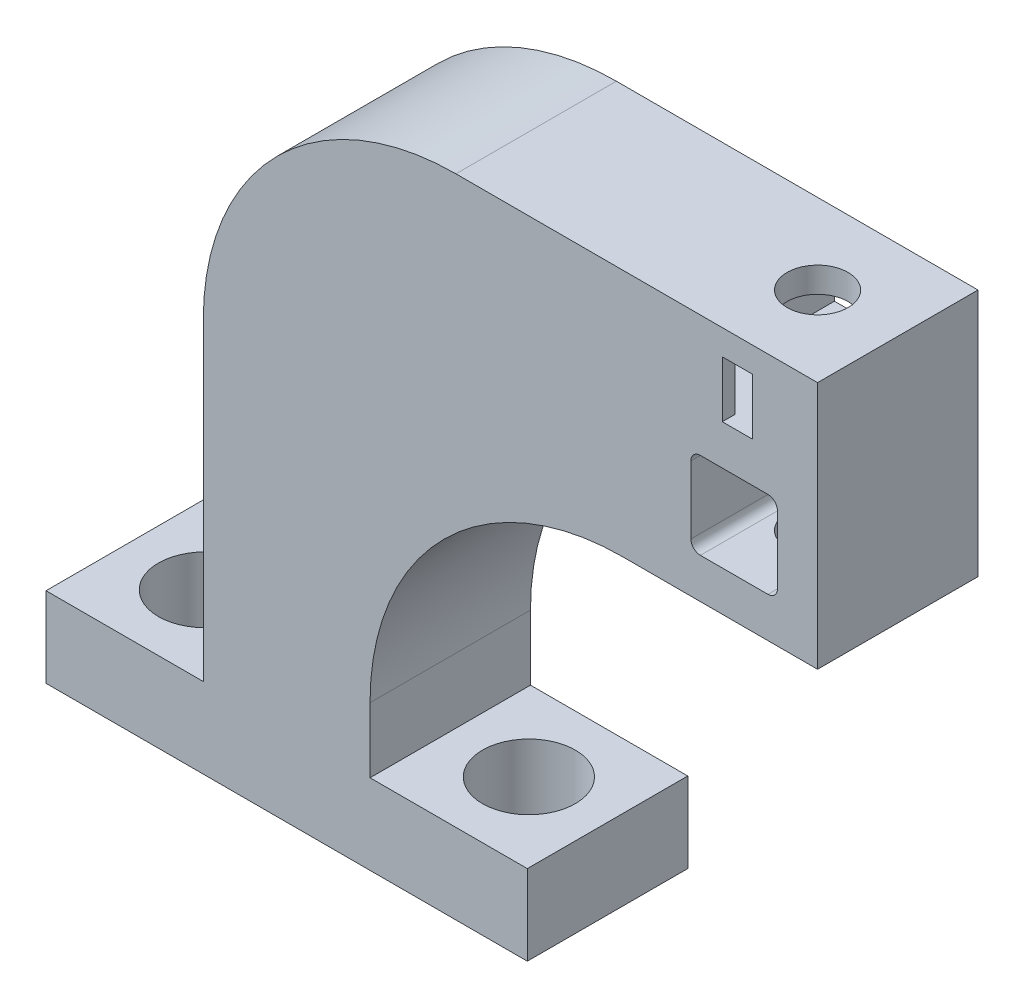
ISO-10303-21;
HEADER;
FILE_DESCRIPTION(('STEP AP214'),'2;1');
FILE_NAME('part.step','',(''),(''),'','','');
FILE_SCHEMA(('AUTOMOTIVE_DESIGN { 1 0 10303 214 1 1 1 1 }'));
ENDSEC;
DATA;
#1=APPLICATION_CONTEXT('core data for automotive mechanical design processes');
#2=APPLICATION_PROTOCOL_DEFINITION('international standard','automotive_design',2000,#1);
#3=PRODUCT_CONTEXT('',#1,'mechanical');
#4=PRODUCT('Part','Part','',(#3));
#5=PRODUCT_RELATED_PRODUCT_CATEGORY('part','',(#4));
#6=PRODUCT_DEFINITION_FORMATION('','',#4);
#7=PRODUCT_DEFINITION_CONTEXT('part definition',#1,'design');
#8=PRODUCT_DEFINITION('design','',#6,#7);
#9=PRODUCT_DEFINITION_SHAPE('','',#8);
#10=(LENGTH_UNIT() NAMED_UNIT(*) SI_UNIT(.MILLI.,.METRE.));
#11=(NAMED_UNIT(*) PLANE_ANGLE_UNIT() SI_UNIT($,.RADIAN.));
#12=(NAMED_UNIT(*) SI_UNIT($,.STERADIAN.) SOLID_ANGLE_UNIT());
#13=UNCERTAINTY_MEASURE_WITH_UNIT(LENGTH_MEASURE(1.E-05),#10,'distance_accuracy_value','');
#14=(GEOMETRIC_REPRESENTATION_CONTEXT(3) GLOBAL_UNCERTAINTY_ASSIGNED_CONTEXT((#13)) GLOBAL_UNIT_ASSIGNED_CONTEXT((#10,
#11,#12)) REPRESENTATION_CONTEXT('',''));
#15=CARTESIAN_POINT('',(0.,0.,0.));
#16=DIRECTION('',(0.,0.,1.));
#17=DIRECTION('',(1.,0.,0.));
#18=AXIS2_PLACEMENT_3D('',#15,#16,#17);
#19=CARTESIAN_POINT('',(0.,0.,57.15));
#20=DIRECTION('',(0.,0.,1.));
#21=DIRECTION('',(1.,0.,0.));
#22=AXIS2_PLACEMENT_3D('',#19,#20,#21);
#23=PLANE('',#22);
#24=DIRECTION('',(1.,0.,0.));
#25=VECTOR('',#24,1.);
#26=CARTESIAN_POINT('',(-95.06,40.417874944,57.15));
#27=LINE('',#26,#25);
#28=CARTESIAN_POINT('',(-75.06,40.417874944,57.15));
#29=VERTEX_POINT('',#28);
#30=CARTESIAN_POINT('',(-46.435,40.417874944,57.15));
#31=VERTEX_POINT('',#30);
#32=EDGE_CURVE('E413',#29,#31,#27,.T.);
#33=ORIENTED_EDGE('',*,*,#32,.F.);
#34=CARTESIAN_POINT('',(-75.06,20.417874944,57.15));
#35=DIRECTION('',(0.,0.,1.));
#36=DIRECTION('',(1.,0.,0.));
#37=AXIS2_PLACEMENT_3D('',#34,#35,#36);
#38=CIRCLE('',#37,20.);
#39=CARTESIAN_POINT('',(-95.06,20.417874944,57.15));
#40=VERTEX_POINT('',#39);
#41=EDGE_CURVE('E443',#29,#40,#38,.T.);
#42=ORIENTED_EDGE('',*,*,#41,.T.);
#43=DIRECTION('',(0.,-1.,0.));
#44=VECTOR('',#43,1.);
#45=CARTESIAN_POINT('',(-95.06,33.964999944,57.15));
#46=LINE('',#45,#44);
#47=CARTESIAN_POINT('',(-95.06,-4.38500005600002,57.15));
#48=VERTEX_POINT('',#47);
#49=EDGE_CURVE('E423',#40,#48,#46,.T.);
#50=ORIENTED_EDGE('',*,*,#49,.T.);
#51=DIRECTION('',(-1.,0.,0.));
#52=VECTOR('',#51,1.);
#53=CARTESIAN_POINT('',(-107.51,-4.38500005600001,57.15));
#54=LINE('',#53,#52);
#55=CARTESIAN_POINT('',(-107.51,-4.38500005600001,57.15));
#56=VERTEX_POINT('',#55);
#57=EDGE_CURVE('E380',#48,#56,#54,.T.);
#58=ORIENTED_EDGE('',*,*,#57,.T.);
#59=DIRECTION('',(0.,-1.,0.));
#60=VECTOR('',#59,1.);
#61=CARTESIAN_POINT('',(-107.51,-4.38500005600001,57.15));
#62=LINE('',#61,#60);
#63=CARTESIAN_POINT('',(-107.51,-10.735000056,57.15));
#64=VERTEX_POINT('',#63);
#65=EDGE_CURVE('E404',#56,#64,#62,.T.);
#66=ORIENTED_EDGE('',*,*,#65,.T.);
#67=DIRECTION('',(1.,0.,0.));
#68=VECTOR('',#67,1.);
#69=CARTESIAN_POINT('',(-95.06,-10.735000056,57.15));
#70=LINE('',#69,#68);
#71=CARTESIAN_POINT('',(-69.41,-10.735000056,57.15));
#72=VERTEX_POINT('',#71);
#73=EDGE_CURVE('E411',#64,#72,#70,.T.);
#74=ORIENTED_EDGE('',*,*,#73,.T.);
#75=DIRECTION('',(0.,-1.,0.));
#76=VECTOR('',#75,1.);
#77=CARTESIAN_POINT('',(-69.41,-4.38500005600001,57.15));
#78=LINE('',#77,#76);
#79=CARTESIAN_POINT('',(-69.41,-4.38500005600001,57.15));
#80=VERTEX_POINT('',#79);
#81=EDGE_CURVE('E392',#80,#72,#78,.T.);
#82=ORIENTED_EDGE('',*,*,#81,.F.);
#83=CARTESIAN_POINT('',(-81.86,-4.38500005600002,57.15));
#84=VERTEX_POINT('',#83);
#85=EDGE_CURVE('E382',#80,#84,#54,.T.);
#86=ORIENTED_EDGE('',*,*,#85,.T.);
#87=DIRECTION('',(0.,1.,0.));
#88=VECTOR('',#87,1.);
#89=CARTESIAN_POINT('',(-81.86,33.964999944,57.15));
#90=LINE('',#89,#88);
#91=CARTESIAN_POINT('',(-81.86,0.764999943999992,57.15));
#92=VERTEX_POINT('',#91);
#93=EDGE_CURVE('E420',#84,#92,#90,.T.);
#94=ORIENTED_EDGE('',*,*,#93,.T.);
#95=CARTESIAN_POINT('',(-61.86,0.764999943999992,57.15));
#96=DIRECTION('',(0.,0.,1.));
#97=DIRECTION('',(1.,0.,0.));
#98=AXIS2_PLACEMENT_3D('',#95,#96,#97);
#99=CIRCLE('',#98,20.);
#100=CARTESIAN_POINT('',(-61.86,20.764999944,57.15));
#101=VERTEX_POINT('',#100);
#102=EDGE_CURVE('E47',#92,#101,#99,.F.);
#103=ORIENTED_EDGE('',*,*,#102,.T.);
#104=DIRECTION('',(1.,0.,0.));
#105=VECTOR('',#104,1.);
#106=CARTESIAN_POINT('',(-46.435,20.764999944,57.15));
#107=LINE('',#106,#105);
#108=CARTESIAN_POINT('',(-46.435,20.764999944,57.15));
#109=VERTEX_POINT('',#108);
#110=EDGE_CURVE('E343',#101,#109,#107,.T.);
#111=ORIENTED_EDGE('',*,*,#110,.T.);
#112=DIRECTION('',(0.,1.,0.));
#113=VECTOR('',#112,1.);
#114=CARTESIAN_POINT('',(-46.435,40.417874944,57.15));
#115=LINE('',#114,#113);
#116=EDGE_CURVE('E358',#109,#31,#115,.T.);
#117=ORIENTED_EDGE('',*,*,#116,.T.);
#118=EDGE_LOOP('',(#33,#42,#50,#58,#66,#74,#82,#86,#94,#103,#111,#117));
#119=FACE_BOUND('',#118,.T.);
#120=DIRECTION('',(0.,1.,0.));
#121=VECTOR('',#120,1.);
#122=CARTESIAN_POINT('',(-49.61,24.689999944,57.15));
#123=LINE('',#122,#121);
#124=CARTESIAN_POINT('',(-49.61,24.689999944,57.15));
#125=VERTEX_POINT('',#124);
#126=CARTESIAN_POINT('',(-49.61,30.039999944,57.15));
#127=VERTEX_POINT('',#126);
#128=EDGE_CURVE('E253',#125,#127,#123,.T.);
#129=ORIENTED_EDGE('',*,*,#128,.F.);
#130=CARTESIAN_POINT('',(-50.36,24.689999944,57.15));
#131=DIRECTION('',(0.,0.,1.));
#132=DIRECTION('',(1.,0.,0.));
#133=AXIS2_PLACEMENT_3D('',#130,#131,#132);
#134=CIRCLE('',#133,0.750000000000001);
#135=CARTESIAN_POINT('',(-50.36,23.939999944,57.15));
#136=VERTEX_POINT('',#135);
#137=EDGE_CURVE('E249',#136,#125,#134,.T.);
#138=ORIENTED_EDGE('',*,*,#137,.F.);
#139=DIRECTION('',(1.,0.,0.));
#140=VECTOR('',#139,1.);
#141=CARTESIAN_POINT('',(-55.71,23.939999944,57.15));
#142=LINE('',#141,#140);
#143=CARTESIAN_POINT('',(-55.71,23.939999944,57.15));
#144=VERTEX_POINT('',#143);
#145=EDGE_CURVE('E337',#144,#136,#142,.T.);
#146=ORIENTED_EDGE('',*,*,#145,.F.);
#147=CARTESIAN_POINT('',(-55.71,24.689999944,57.15));
#148=DIRECTION('',(0.,0.,1.));
#149=DIRECTION('',(1.,0.,0.));
#150=AXIS2_PLACEMENT_3D('',#147,#148,#149);
#151=CIRCLE('',#150,0.749999999999994);
#152=CARTESIAN_POINT('',(-56.46,24.689999944,57.15));
#153=VERTEX_POINT('',#152);
#154=EDGE_CURVE('E334',#153,#144,#151,.T.);
#155=ORIENTED_EDGE('',*,*,#154,.F.);
#156=DIRECTION('',(0.,-1.,0.));
#157=VECTOR('',#156,1.);
#158=CARTESIAN_POINT('',(-56.46,30.039999944,57.15));
#159=LINE('',#158,#157);
#160=CARTESIAN_POINT('',(-56.46,30.039999944,57.15));
#161=VERTEX_POINT('',#160);
#162=EDGE_CURVE('E331',#161,#153,#159,.T.);
#163=ORIENTED_EDGE('',*,*,#162,.F.);
#164=CARTESIAN_POINT('',(-55.71,30.039999944,57.15));
#165=DIRECTION('',(0.,0.,1.));
#166=DIRECTION('',(1.,0.,0.));
#167=AXIS2_PLACEMENT_3D('',#164,#165,#166);
#168=CIRCLE('',#167,0.750000000000001);
#169=CARTESIAN_POINT('',(-55.71,30.789999944,57.15));
#170=VERTEX_POINT('',#169);
#171=EDGE_CURVE('E328',#170,#161,#168,.T.);
#172=ORIENTED_EDGE('',*,*,#171,.F.);
#173=DIRECTION('',(-1.,0.,0.));
#174=VECTOR('',#173,1.);
#175=CARTESIAN_POINT('',(-50.36,30.789999944,57.15));
#176=LINE('',#175,#174);
#177=CARTESIAN_POINT('',(-50.36,30.789999944,57.15));
#178=VERTEX_POINT('',#177);
#179=EDGE_CURVE('E325',#178,#170,#176,.T.);
#180=ORIENTED_EDGE('',*,*,#179,.F.);
#181=CARTESIAN_POINT('',(-50.36,30.039999944,57.15));
#182=DIRECTION('',(0.,0.,1.));
#183=DIRECTION('',(1.,0.,0.));
#184=AXIS2_PLACEMENT_3D('',#181,#182,#183);
#185=CIRCLE('',#184,0.750000000000001);
#186=EDGE_CURVE('E322',#127,#178,#185,.T.);
#187=ORIENTED_EDGE('',*,*,#186,.F.);
#188=EDGE_LOOP('',(#129,#138,#146,#155,#163,#172,#180,#187));
#189=FACE_BOUND('',#188,.T.);
#190=DIRECTION('',(0.,-1.,0.));
#191=VECTOR('',#190,1.);
#192=CARTESIAN_POINT('',(-51.5934591186013,54.5978200922383,57.15));
#193=LINE('',#192,#191);
#194=CARTESIAN_POINT('',(-51.5934591186013,38.417874944,57.15));
#195=VERTEX_POINT('',#194);
#196=CARTESIAN_POINT('',(-51.5934591186013,33.964999944,57.15));
#197=VERTEX_POINT('',#196);
#198=EDGE_CURVE('E248',#195,#197,#193,.T.);
#199=ORIENTED_EDGE('',*,*,#198,.T.);
#200=DIRECTION('',(1.,0.,0.));
#201=VECTOR('',#200,1.);
#202=CARTESIAN_POINT('',(-53.9765408813987,33.964999944,57.15));
#203=LINE('',#202,#201);
#204=CARTESIAN_POINT('',(-53.9765408813987,33.964999944,57.15));
#205=VERTEX_POINT('',#204);
#206=EDGE_CURVE('E288',#205,#197,#203,.T.);
#207=ORIENTED_EDGE('',*,*,#206,.F.);
#208=DIRECTION('',(0.,-1.,0.));
#209=VECTOR('',#208,1.);
#210=CARTESIAN_POINT('',(-53.9765408813987,54.5978200922383,57.15));
#211=LINE('',#210,#209);
#212=CARTESIAN_POINT('',(-53.9765408813987,38.417874944,57.15));
#213=VERTEX_POINT('',#212);
#214=EDGE_CURVE('E286',#213,#205,#211,.T.);
#215=ORIENTED_EDGE('',*,*,#214,.F.);
#216=DIRECTION('',(1.,0.,0.));
#217=VECTOR('',#216,1.);
#218=CARTESIAN_POINT('',(-53.9765408813987,38.417874944,57.15));
#219=LINE('',#218,#217);
#220=EDGE_CURVE('E250',#213,#195,#219,.T.);
#221=ORIENTED_EDGE('',*,*,#220,.T.);
#222=EDGE_LOOP('',(#199,#207,#215,#221));
#223=FACE_BOUND('',#222,.T.);
#224=ADVANCED_FACE('F39',(#119,#189,#223),#23,.T.);
#225=CARTESIAN_POINT('',(0.,0.,44.45));
#226=DIRECTION('',(0.,0.,1.));
#227=DIRECTION('',(1.,0.,0.));
#228=AXIS2_PLACEMENT_3D('',#225,#226,#227);
#229=PLANE('',#228);
#230=DIRECTION('',(0.,-1.,0.));
#231=VECTOR('',#230,1.);
#232=CARTESIAN_POINT('',(-95.06,33.964999944,44.45));
#233=LINE('',#232,#231);
#234=CARTESIAN_POINT('',(-95.06,20.417874944,44.45));
#235=VERTEX_POINT('',#234);
#236=CARTESIAN_POINT('',(-95.06,-4.38500005600002,44.45));
#237=VERTEX_POINT('',#236);
#238=EDGE_CURVE('E424',#235,#237,#233,.T.);
#239=ORIENTED_EDGE('',*,*,#238,.F.);
#240=CARTESIAN_POINT('',(-75.06,20.417874944,44.45));
#241=DIRECTION('',(0.,0.,1.));
#242=DIRECTION('',(1.,0.,0.));
#243=AXIS2_PLACEMENT_3D('',#240,#241,#242);
#244=CIRCLE('',#243,20.);
#245=CARTESIAN_POINT('',(-75.06,40.417874944,44.45));
#246=VERTEX_POINT('',#245);
#247=EDGE_CURVE('E447',#235,#246,#244,.F.);
#248=ORIENTED_EDGE('',*,*,#247,.T.);
#249=DIRECTION('',(-1.,0.,0.));
#250=VECTOR('',#249,1.);
#251=CARTESIAN_POINT('',(-81.86,40.417874944,44.45));
#252=LINE('',#251,#250);
#253=CARTESIAN_POINT('',(-46.435,40.417874944,44.45));
#254=VERTEX_POINT('',#253);
#255=EDGE_CURVE('E416',#254,#246,#252,.T.);
#256=ORIENTED_EDGE('',*,*,#255,.F.);
#257=DIRECTION('',(0.,-1.,0.));
#258=VECTOR('',#257,1.);
#259=CARTESIAN_POINT('',(-46.435,40.417874944,44.45));
#260=LINE('',#259,#258);
#261=CARTESIAN_POINT('',(-46.435,20.764999944,44.45));
#262=VERTEX_POINT('',#261);
#263=EDGE_CURVE('E315',#254,#262,#260,.T.);
#264=ORIENTED_EDGE('',*,*,#263,.T.);
#265=DIRECTION('',(-1.,0.,0.));
#266=VECTOR('',#265,1.);
#267=CARTESIAN_POINT('',(-46.435,20.764999944,44.45));
#268=LINE('',#267,#266);
#269=CARTESIAN_POINT('',(-61.86,20.764999944,44.45));
#270=VERTEX_POINT('',#269);
#271=EDGE_CURVE('E296',#262,#270,#268,.T.);
#272=ORIENTED_EDGE('',*,*,#271,.T.);
#273=CARTESIAN_POINT('',(-61.86,0.764999943999992,44.45));
#274=DIRECTION('',(0.,0.,1.));
#275=DIRECTION('',(1.,0.,0.));
#276=AXIS2_PLACEMENT_3D('',#273,#274,#275);
#277=CIRCLE('',#276,20.);
#278=CARTESIAN_POINT('',(-81.86,0.764999943999992,44.45));
#279=VERTEX_POINT('',#278);
#280=EDGE_CURVE('E11',#270,#279,#277,.T.);
#281=ORIENTED_EDGE('',*,*,#280,.T.);
#282=DIRECTION('',(0.,1.,0.));
#283=VECTOR('',#282,1.);
#284=CARTESIAN_POINT('',(-81.86,33.964999944,44.45));
#285=LINE('',#284,#283);
#286=CARTESIAN_POINT('',(-81.86,-4.38500005600002,44.45));
#287=VERTEX_POINT('',#286);
#288=EDGE_CURVE('E419',#287,#279,#285,.T.);
#289=ORIENTED_EDGE('',*,*,#288,.F.);
#290=DIRECTION('',(1.,0.,0.));
#291=VECTOR('',#290,1.);
#292=CARTESIAN_POINT('',(-107.51,-4.38500005600002,44.45));
#293=LINE('',#292,#291);
#294=CARTESIAN_POINT('',(-69.41,-4.38500005600002,44.45));
#295=VERTEX_POINT('',#294);
#296=EDGE_CURVE('E388',#287,#295,#293,.T.);
#297=ORIENTED_EDGE('',*,*,#296,.T.);
#298=DIRECTION('',(0.,-1.,0.));
#299=VECTOR('',#298,1.);
#300=CARTESIAN_POINT('',(-69.41,-4.38500005600002,44.45));
#301=LINE('',#300,#299);
#302=CARTESIAN_POINT('',(-69.41,-10.735000056,44.45));
#303=VERTEX_POINT('',#302);
#304=EDGE_CURVE('E397',#295,#303,#301,.T.);
#305=ORIENTED_EDGE('',*,*,#304,.T.);
#306=DIRECTION('',(-1.,0.,0.));
#307=VECTOR('',#306,1.);
#308=CARTESIAN_POINT('',(-95.06,-10.735000056,44.45));
#309=LINE('',#308,#307);
#310=CARTESIAN_POINT('',(-107.51,-10.735000056,44.45));
#311=VERTEX_POINT('',#310);
#312=EDGE_CURVE('E410',#303,#311,#309,.T.);
#313=ORIENTED_EDGE('',*,*,#312,.T.);
#314=DIRECTION('',(0.,-1.,0.));
#315=VECTOR('',#314,1.);
#316=CARTESIAN_POINT('',(-107.51,-4.38500005600002,44.45));
#317=LINE('',#316,#315);
#318=CARTESIAN_POINT('',(-107.51,-4.38500005600002,44.45));
#319=VERTEX_POINT('',#318);
#320=EDGE_CURVE('E401',#319,#311,#317,.T.);
#321=ORIENTED_EDGE('',*,*,#320,.F.);
#322=EDGE_CURVE('E389',#319,#237,#293,.T.);
#323=ORIENTED_EDGE('',*,*,#322,.T.);
#324=EDGE_LOOP('',(#239,#248,#256,#264,#272,#281,#289,#297,#305,#313,#321,#323));
#325=FACE_BOUND('',#324,.T.);
#326=DIRECTION('',(-1.,0.,0.));
#327=VECTOR('',#326,1.);
#328=CARTESIAN_POINT('',(-47.7725,33.964999944,44.45));
#329=LINE('',#328,#327);
#330=CARTESIAN_POINT('',(-47.7725,33.964999944,44.45));
#331=VERTEX_POINT('',#330);
#332=CARTESIAN_POINT('',(-57.7975,33.964999944,44.45));
#333=VERTEX_POINT('',#332);
#334=EDGE_CURVE('E275',#331,#333,#329,.T.);
#335=ORIENTED_EDGE('',*,*,#334,.F.);
#336=DIRECTION('',(0.,-1.,0.));
#337=VECTOR('',#336,1.);
#338=CARTESIAN_POINT('',(-47.7725,54.5978200922383,44.45));
#339=LINE('',#338,#337);
#340=CARTESIAN_POINT('',(-47.7725,38.417874944,44.45));
#341=VERTEX_POINT('',#340);
#342=EDGE_CURVE('E273',#341,#331,#339,.T.);
#343=ORIENTED_EDGE('',*,*,#342,.F.);
#344=DIRECTION('',(-1.,0.,0.));
#345=VECTOR('',#344,1.);
#346=CARTESIAN_POINT('',(-47.7725,38.417874944,44.45));
#347=LINE('',#346,#345);
#348=CARTESIAN_POINT('',(-57.7975,38.417874944,44.45));
#349=VERTEX_POINT('',#348);
#350=EDGE_CURVE('E269',#341,#349,#347,.T.);
#351=ORIENTED_EDGE('',*,*,#350,.T.);
#352=DIRECTION('',(0.,-1.,0.));
#353=VECTOR('',#352,1.);
#354=CARTESIAN_POINT('',(-57.7975,54.5978200922383,44.45));
#355=LINE('',#354,#353);
#356=EDGE_CURVE('E276',#349,#333,#355,.T.);
#357=ORIENTED_EDGE('',*,*,#356,.T.);
#358=EDGE_LOOP('',(#335,#343,#351,#357));
#359=FACE_BOUND('',#358,.T.);
#360=DIRECTION('',(0.,-1.,0.));
#361=VECTOR('',#360,1.);
#362=CARTESIAN_POINT('',(-49.61,24.689999944,44.45));
#363=LINE('',#362,#361);
#364=CARTESIAN_POINT('',(-49.61,30.039999944,44.45));
#365=VERTEX_POINT('',#364);
#366=CARTESIAN_POINT('',(-49.61,24.689999944,44.45));
#367=VERTEX_POINT('',#366);
#368=EDGE_CURVE('E318',#365,#367,#363,.T.);
#369=ORIENTED_EDGE('',*,*,#368,.F.);
#370=CARTESIAN_POINT('',(-50.36,30.039999944,44.45));
#371=DIRECTION('',(0.,0.,1.));
#372=DIRECTION('',(1.,0.,0.));
#373=AXIS2_PLACEMENT_3D('',#370,#371,#372);
#374=CIRCLE('',#373,0.750000000000001);
#375=CARTESIAN_POINT('',(-50.36,30.789999944,44.45));
#376=VERTEX_POINT('',#375);
#377=EDGE_CURVE('E293',#376,#365,#374,.F.);
#378=ORIENTED_EDGE('',*,*,#377,.F.);
#379=DIRECTION('',(1.,0.,0.));
#380=VECTOR('',#379,1.);
#381=CARTESIAN_POINT('',(-50.36,30.789999944,44.45));
#382=LINE('',#381,#380);
#383=CARTESIAN_POINT('',(-55.71,30.789999944,44.45));
#384=VERTEX_POINT('',#383);
#385=EDGE_CURVE('E297',#384,#376,#382,.T.);
#386=ORIENTED_EDGE('',*,*,#385,.F.);
#387=CARTESIAN_POINT('',(-55.71,30.039999944,44.45));
#388=DIRECTION('',(0.,0.,1.));
#389=DIRECTION('',(1.,0.,0.));
#390=AXIS2_PLACEMENT_3D('',#387,#388,#389);
#391=CIRCLE('',#390,0.750000000000001);
#392=CARTESIAN_POINT('',(-56.46,30.039999944,44.45));
#393=VERTEX_POINT('',#392);
#394=EDGE_CURVE('E300',#393,#384,#391,.F.);
#395=ORIENTED_EDGE('',*,*,#394,.F.);
#396=DIRECTION('',(0.,1.,0.));
#397=VECTOR('',#396,1.);
#398=CARTESIAN_POINT('',(-56.46,30.039999944,44.45));
#399=LINE('',#398,#397);
#400=CARTESIAN_POINT('',(-56.46,24.689999944,44.45));
#401=VERTEX_POINT('',#400);
#402=EDGE_CURVE('E303',#401,#393,#399,.T.);
#403=ORIENTED_EDGE('',*,*,#402,.F.);
#404=CARTESIAN_POINT('',(-55.71,24.689999944,44.45));
#405=DIRECTION('',(0.,0.,1.));
#406=DIRECTION('',(1.,0.,0.));
#407=AXIS2_PLACEMENT_3D('',#404,#405,#406);
#408=CIRCLE('',#407,0.749999999999994);
#409=CARTESIAN_POINT('',(-55.71,23.939999944,44.45));
#410=VERTEX_POINT('',#409);
#411=EDGE_CURVE('E306',#410,#401,#408,.F.);
#412=ORIENTED_EDGE('',*,*,#411,.F.);
#413=DIRECTION('',(-1.,0.,0.));
#414=VECTOR('',#413,1.);
#415=CARTESIAN_POINT('',(-55.71,23.939999944,44.45));
#416=LINE('',#415,#414);
#417=CARTESIAN_POINT('',(-50.36,23.939999944,44.45));
#418=VERTEX_POINT('',#417);
#419=EDGE_CURVE('E309',#418,#410,#416,.T.);
#420=ORIENTED_EDGE('',*,*,#419,.F.);
#421=CARTESIAN_POINT('',(-50.36,24.689999944,44.45));
#422=DIRECTION('',(0.,0.,1.));
#423=DIRECTION('',(1.,0.,0.));
#424=AXIS2_PLACEMENT_3D('',#421,#422,#423);
#425=CIRCLE('',#424,0.750000000000001);
#426=EDGE_CURVE('E312',#367,#418,#425,.F.);
#427=ORIENTED_EDGE('',*,*,#426,.F.);
#428=EDGE_LOOP('',(#369,#378,#386,#395,#403,#412,#420,#427));
#429=FACE_BOUND('',#428,.T.);
#430=ADVANCED_FACE('F465',(#325,#359,#429),#229,.F.);
#431=CARTESIAN_POINT('',(-81.86,33.964999944,57.15));
#432=DIRECTION('',(-1.,0.,0.));
#433=DIRECTION('',(0.,0.,1.));
#434=AXIS2_PLACEMENT_3D('',#431,#432,#433);
#435=PLANE('',#434);
#436=ORIENTED_EDGE('',*,*,#288,.T.);
#437=DIRECTION('',(0.,0.,1.));
#438=VECTOR('',#437,1.);
#439=CARTESIAN_POINT('',(-81.86,0.764999943999992,57.15));
#440=LINE('',#439,#438);
#441=EDGE_CURVE('E449',#279,#92,#440,.T.);
#442=ORIENTED_EDGE('',*,*,#441,.T.);
#443=ORIENTED_EDGE('',*,*,#93,.F.);
#444=DIRECTION('',(0.,0.,-1.));
#445=VECTOR('',#444,1.);
#446=CARTESIAN_POINT('',(-81.86,-4.38500005600002,57.15));
#447=LINE('',#446,#445);
#448=EDGE_CURVE('E400',#84,#287,#447,.T.);
#449=ORIENTED_EDGE('',*,*,#448,.T.);
#450=EDGE_LOOP('',(#436,#442,#443,#449));
#451=FACE_BOUND('',#450,.T.);
#452=ADVANCED_FACE('F461',(#451),#435,.F.);
#453=CARTESIAN_POINT('',(-95.06,33.964999944,57.15));
#454=DIRECTION('',(1.,0.,0.));
#455=DIRECTION('',(0.,0.,-1.));
#456=AXIS2_PLACEMENT_3D('',#453,#454,#455);
#457=PLANE('',#456);
#458=ORIENTED_EDGE('',*,*,#49,.F.);
#459=DIRECTION('',(0.,0.,1.));
#460=VECTOR('',#459,1.);
#461=CARTESIAN_POINT('',(-95.06,20.417874944,44.45));
#462=LINE('',#461,#460);
#463=EDGE_CURVE('E445',#40,#235,#462,.F.);
#464=ORIENTED_EDGE('',*,*,#463,.T.);
#465=ORIENTED_EDGE('',*,*,#238,.T.);
#466=DIRECTION('',(0.,0.,1.));
#467=VECTOR('',#466,1.);
#468=CARTESIAN_POINT('',(-95.06,-4.38500005600002,57.15));
#469=LINE('',#468,#467);
#470=EDGE_CURVE('E426',#237,#48,#469,.T.);
#471=ORIENTED_EDGE('',*,*,#470,.T.);
#472=EDGE_LOOP('',(#458,#464,#465,#471));
#473=FACE_BOUND('',#472,.T.);
#474=ADVANCED_FACE('F525',(#473),#457,.F.);
#475=CARTESIAN_POINT('',(0.,40.417874944,0.));
#476=DIRECTION('',(0.,1.,0.));
#477=DIRECTION('',(0.,0.,1.));
#478=AXIS2_PLACEMENT_3D('',#475,#476,#477);
#479=PLANE('',#478);
#480=ORIENTED_EDGE('',*,*,#255,.T.);
#481=DIRECTION('',(0.,0.,1.));
#482=VECTOR('',#481,1.);
#483=CARTESIAN_POINT('',(-75.06,40.417874944,57.15));
#484=LINE('',#483,#482);
#485=EDGE_CURVE('E431',#246,#29,#484,.T.);
#486=ORIENTED_EDGE('',*,*,#485,.T.);
#487=ORIENTED_EDGE('',*,*,#32,.T.);
#488=DIRECTION('',(0.,0.,1.));
#489=VECTOR('',#488,1.);
#490=CARTESIAN_POINT('',(-46.435,40.417874944,3.9386914458984));
#491=LINE('',#490,#489);
#492=EDGE_CURVE('E362',#254,#31,#491,.T.);
#493=ORIENTED_EDGE('',*,*,#492,.F.);
#494=EDGE_LOOP('',(#480,#486,#487,#493));
#495=FACE_BOUND('',#494,.T.);
#496=CARTESIAN_POINT('',(-52.785,40.417874944,50.8));
#497=DIRECTION('',(0.,1.,0.));
#498=DIRECTION('',(0.,0.,1.));
#499=AXIS2_PLACEMENT_3D('',#496,#497,#498);
#500=CIRCLE('',#499,2.41299999999999);
#501=CARTESIAN_POINT('',(-52.785,40.417874944,53.213));
#502=VERTEX_POINT('',#501);
#503=EDGE_CURVE('E440',#502,#502,#500,.T.);
#504=ORIENTED_EDGE('',*,*,#503,.F.);
#505=EDGE_LOOP('',(#504));
#506=FACE_BOUND('',#505,.T.);
#507=ADVANCED_FACE('F495',(#495,#506),#479,.T.);
#508=CARTESIAN_POINT('',(-84.5646703375213,-10.735000056,-24.4418244148077));
#509=DIRECTION('',(0.,1.,0.));
#510=DIRECTION('',(0.,0.,1.));
#511=AXIS2_PLACEMENT_3D('',#508,#509,#510);
#512=PLANE('',#511);
#513=CARTESIAN_POINT('',(-101.285,-10.735000056,50.8));
#514=DIRECTION('',(0.,1.,0.));
#515=DIRECTION('',(0.,0.,1.));
#516=AXIS2_PLACEMENT_3D('',#513,#514,#515);
#517=CIRCLE('',#516,3.675);
#518=CARTESIAN_POINT('',(-101.285,-10.735000056,54.475));
#519=VERTEX_POINT('',#518);
#520=EDGE_CURVE('E373',#519,#519,#517,.T.);
#521=ORIENTED_EDGE('',*,*,#520,.T.);
#522=EDGE_LOOP('',(#521));
#523=FACE_BOUND('',#522,.T.);
#524=DIRECTION('',(0.,0.,-1.));
#525=VECTOR('',#524,1.);
#526=CARTESIAN_POINT('',(-107.51,-10.735000056,44.45));
#527=LINE('',#526,#525);
#528=EDGE_CURVE('E381',#64,#311,#527,.T.);
#529=ORIENTED_EDGE('',*,*,#528,.T.);
#530=ORIENTED_EDGE('',*,*,#312,.F.);
#531=DIRECTION('',(0.,0.,1.));
#532=VECTOR('',#531,1.);
#533=CARTESIAN_POINT('',(-69.41,-10.735000056,44.45));
#534=LINE('',#533,#532);
#535=EDGE_CURVE('E376',#303,#72,#534,.T.);
#536=ORIENTED_EDGE('',*,*,#535,.T.);
#537=ORIENTED_EDGE('',*,*,#73,.F.);
#538=EDGE_LOOP('',(#529,#530,#536,#537));
#539=FACE_BOUND('',#538,.T.);
#540=CARTESIAN_POINT('',(-75.635,-10.735000056,50.8));
#541=DIRECTION('',(0.,1.,0.));
#542=DIRECTION('',(0.,0.,1.));
#543=AXIS2_PLACEMENT_3D('',#540,#541,#542);
#544=CIRCLE('',#543,3.675);
#545=CARTESIAN_POINT('',(-75.635,-10.735000056,54.475));
#546=VERTEX_POINT('',#545);
#547=EDGE_CURVE('E369',#546,#546,#544,.T.);
#548=ORIENTED_EDGE('',*,*,#547,.T.);
#549=EDGE_LOOP('',(#548));
#550=FACE_BOUND('',#549,.T.);
#551=ADVANCED_FACE('F482',(#523,#539,#550),#512,.F.);
#552=CARTESIAN_POINT('',(-107.51,-4.38500005600002,44.45));
#553=DIRECTION('',(-1.,0.,0.));
#554=DIRECTION('',(0.,-1.,0.));
#555=AXIS2_PLACEMENT_3D('',#552,#553,#554);
#556=PLANE('',#555);
#557=ORIENTED_EDGE('',*,*,#528,.F.);
#558=ORIENTED_EDGE('',*,*,#65,.F.);
#559=DIRECTION('',(0.,0.,-1.));
#560=VECTOR('',#559,1.);
#561=CARTESIAN_POINT('',(-107.51,-4.38500005600002,44.45));
#562=LINE('',#561,#560);
#563=EDGE_CURVE('E385',#56,#319,#562,.T.);
#564=ORIENTED_EDGE('',*,*,#563,.T.);
#565=ORIENTED_EDGE('',*,*,#320,.T.);
#566=EDGE_LOOP('',(#557,#558,#564,#565));
#567=FACE_BOUND('',#566,.T.);
#568=ADVANCED_FACE('F478',(#567),#556,.T.);
#569=CARTESIAN_POINT('',(0.,-4.38500005600003,0.));
#570=DIRECTION('',(0.,1.,0.));
#571=DIRECTION('',(0.,0.,1.));
#572=AXIS2_PLACEMENT_3D('',#569,#570,#571);
#573=PLANE('',#572);
#574=CARTESIAN_POINT('',(-101.285,-4.38500005600002,50.8));
#575=DIRECTION('',(0.,1.,0.));
#576=DIRECTION('',(0.,0.,1.));
#577=AXIS2_PLACEMENT_3D('',#574,#575,#576);
#578=CIRCLE('',#577,3.675);
#579=CARTESIAN_POINT('',(-101.285,-4.38500005600002,54.475));
#580=VERTEX_POINT('',#579);
#581=EDGE_CURVE('E372',#580,#580,#578,.T.);
#582=ORIENTED_EDGE('',*,*,#581,.F.);
#583=EDGE_LOOP('',(#582));
#584=FACE_BOUND('',#583,.T.);
#585=ORIENTED_EDGE('',*,*,#470,.F.);
#586=ORIENTED_EDGE('',*,*,#322,.F.);
#587=ORIENTED_EDGE('',*,*,#563,.F.);
#588=ORIENTED_EDGE('',*,*,#57,.F.);
#589=EDGE_LOOP('',(#585,#586,#587,#588));
#590=FACE_BOUND('',#589,.T.);
#591=ADVANCED_FACE('F487',(#584,#590),#573,.T.);
#592=CARTESIAN_POINT('',(-75.635,-4.38500005600002,50.8));
#593=DIRECTION('',(0.,1.,0.));
#594=DIRECTION('',(0.,0.,1.));
#595=AXIS2_PLACEMENT_3D('',#592,#593,#594);
#596=CIRCLE('',#595,3.675);
#597=CARTESIAN_POINT('',(-75.635,-4.38500005600002,54.475));
#598=VERTEX_POINT('',#597);
#599=EDGE_CURVE('E317',#598,#598,#596,.T.);
#600=ORIENTED_EDGE('',*,*,#599,.F.);
#601=EDGE_LOOP('',(#600));
#602=FACE_BOUND('',#601,.T.);
#603=ORIENTED_EDGE('',*,*,#448,.F.);
#604=ORIENTED_EDGE('',*,*,#85,.F.);
#605=DIRECTION('',(0.,0.,1.));
#606=VECTOR('',#605,1.);
#607=CARTESIAN_POINT('',(-69.41,-4.38500005600002,44.45));
#608=LINE('',#607,#606);
#609=EDGE_CURVE('E377',#295,#80,#608,.T.);
#610=ORIENTED_EDGE('',*,*,#609,.F.);
#611=ORIENTED_EDGE('',*,*,#296,.F.);
#612=EDGE_LOOP('',(#603,#604,#610,#611));
#613=FACE_BOUND('',#612,.T.);
#614=ADVANCED_FACE('F470',(#602,#613),#573,.T.);
#615=CARTESIAN_POINT('',(-69.41,-4.38500005600002,44.45));
#616=DIRECTION('',(1.,0.,0.));
#617=DIRECTION('',(0.,1.,0.));
#618=AXIS2_PLACEMENT_3D('',#615,#616,#617);
#619=PLANE('',#618);
#620=ORIENTED_EDGE('',*,*,#535,.F.);
#621=ORIENTED_EDGE('',*,*,#304,.F.);
#622=ORIENTED_EDGE('',*,*,#609,.T.);
#623=ORIENTED_EDGE('',*,*,#81,.T.);
#624=EDGE_LOOP('',(#620,#621,#622,#623));
#625=FACE_BOUND('',#624,.T.);
#626=ADVANCED_FACE('F474',(#625),#619,.T.);
#627=CARTESIAN_POINT('',(-75.635,50.8,50.8));
#628=DIRECTION('',(0.,-1.,0.));
#629=DIRECTION('',(0.,0.,-1.));
#630=AXIS2_PLACEMENT_3D('',#627,#628,#629);
#631=CYLINDRICAL_SURFACE('',#630,3.675);
#632=ORIENTED_EDGE('',*,*,#599,.T.);
#633=EDGE_LOOP('',(#632));
#634=FACE_BOUND('',#633,.T.);
#635=ORIENTED_EDGE('',*,*,#547,.F.);
#636=EDGE_LOOP('',(#635));
#637=FACE_BOUND('',#636,.T.);
#638=ADVANCED_FACE('F805',(#634,#637),#631,.F.);
#639=CARTESIAN_POINT('',(-101.285,50.8,50.8));
#640=DIRECTION('',(0.,-1.,0.));
#641=DIRECTION('',(0.,0.,-1.));
#642=AXIS2_PLACEMENT_3D('',#639,#640,#641);
#643=CYLINDRICAL_SURFACE('',#642,3.675);
#644=ORIENTED_EDGE('',*,*,#581,.T.);
#645=EDGE_LOOP('',(#644));
#646=FACE_BOUND('',#645,.T.);
#647=ORIENTED_EDGE('',*,*,#520,.F.);
#648=EDGE_LOOP('',(#647));
#649=FACE_BOUND('',#648,.T.);
#650=ADVANCED_FACE('F512',(#646,#649),#643,.F.);
#651=CARTESIAN_POINT('',(-46.435,20.764999944,3.9386914458984));
#652=DIRECTION('',(0.,-1.,0.));
#653=DIRECTION('',(1.,0.,0.));
#654=AXIS2_PLACEMENT_3D('',#651,#652,#653);
#655=PLANE('',#654);
#656=CARTESIAN_POINT('',(-52.785,20.764999944,50.8));
#657=DIRECTION('',(0.,-1.,0.));
#658=DIRECTION('',(1.,0.,0.));
#659=AXIS2_PLACEMENT_3D('',#656,#657,#658);
#660=CIRCLE('',#659,2.41299999999999);
#661=CARTESIAN_POINT('',(-50.372,20.764999944,50.8));
#662=VERTEX_POINT('',#661);
#663=EDGE_CURVE('E292',#662,#662,#660,.T.);
#664=ORIENTED_EDGE('',*,*,#663,.F.);
#665=EDGE_LOOP('',(#664));
#666=FACE_BOUND('',#665,.T.);
#667=ORIENTED_EDGE('',*,*,#110,.F.);
#668=DIRECTION('',(0.,0.,1.));
#669=VECTOR('',#668,1.);
#670=CARTESIAN_POINT('',(-61.86,20.764999944,3.9386914458984));
#671=LINE('',#670,#669);
#672=EDGE_CURVE('E60',#101,#270,#671,.F.);
#673=ORIENTED_EDGE('',*,*,#672,.T.);
#674=ORIENTED_EDGE('',*,*,#271,.F.);
#675=DIRECTION('',(0.,0.,1.));
#676=VECTOR('',#675,1.);
#677=CARTESIAN_POINT('',(-46.435,20.764999944,3.9386914458984));
#678=LINE('',#677,#676);
#679=EDGE_CURVE('E361',#262,#109,#678,.T.);
#680=ORIENTED_EDGE('',*,*,#679,.T.);
#681=EDGE_LOOP('',(#667,#673,#674,#680));
#682=FACE_BOUND('',#681,.T.);
#683=ADVANCED_FACE('F457',(#666,#682),#655,.T.);
#684=CARTESIAN_POINT('',(-46.435,40.417874944,3.9386914458984));
#685=DIRECTION('',(1.,0.,0.));
#686=DIRECTION('',(0.,0.,-1.));
#687=AXIS2_PLACEMENT_3D('',#684,#685,#686);
#688=PLANE('',#687);
#689=ORIENTED_EDGE('',*,*,#263,.F.);
#690=ORIENTED_EDGE('',*,*,#492,.T.);
#691=ORIENTED_EDGE('',*,*,#116,.F.);
#692=ORIENTED_EDGE('',*,*,#679,.F.);
#693=EDGE_LOOP('',(#689,#690,#691,#692));
#694=FACE_BOUND('',#693,.T.);
#695=ADVANCED_FACE('F501',(#694),#688,.T.);
#696=CARTESIAN_POINT('',(-49.61,24.689999944,3.9386914458984));
#697=DIRECTION('',(1.,0.,0.));
#698=DIRECTION('',(0.,0.,-1.));
#699=AXIS2_PLACEMENT_3D('',#696,#697,#698);
#700=PLANE('',#699);
#701=DIRECTION('',(0.,0.,1.));
#702=VECTOR('',#701,1.);
#703=CARTESIAN_POINT('',(-49.61,30.039999944,3.9386914458984));
#704=LINE('',#703,#702);
#705=EDGE_CURVE('E354',#365,#127,#704,.T.);
#706=ORIENTED_EDGE('',*,*,#705,.F.);
#707=ORIENTED_EDGE('',*,*,#368,.T.);
#708=DIRECTION('',(0.,0.,1.));
#709=VECTOR('',#708,1.);
#710=CARTESIAN_POINT('',(-49.61,24.689999944,3.9386914458984));
#711=LINE('',#710,#709);
#712=EDGE_CURVE('E340',#367,#125,#711,.T.);
#713=ORIENTED_EDGE('',*,*,#712,.T.);
#714=ORIENTED_EDGE('',*,*,#128,.T.);
#715=EDGE_LOOP('',(#706,#707,#713,#714));
#716=FACE_BOUND('',#715,.T.);
#717=ADVANCED_FACE('F503',(#716),#700,.F.);
#718=CARTESIAN_POINT('',(-50.36,30.039999944,3.9386914458984));
#719=DIRECTION('',(0.,0.,1.));
#720=DIRECTION('',(1.,0.,0.));
#721=AXIS2_PLACEMENT_3D('',#718,#719,#720);
#722=CYLINDRICAL_SURFACE('',#721,0.750000000000001);
#723=DIRECTION('',(0.,0.,1.));
#724=VECTOR('',#723,1.);
#725=CARTESIAN_POINT('',(-50.36,30.789999944,3.9386914458984));
#726=LINE('',#725,#724);
#727=EDGE_CURVE('E352',#376,#178,#726,.T.);
#728=ORIENTED_EDGE('',*,*,#727,.F.);
#729=ORIENTED_EDGE('',*,*,#377,.T.);
#730=ORIENTED_EDGE('',*,*,#705,.T.);
#731=ORIENTED_EDGE('',*,*,#186,.T.);
#732=EDGE_LOOP('',(#728,#729,#730,#731));
#733=FACE_BOUND('',#732,.T.);
#734=ADVANCED_FACE('F509',(#733),#722,.F.);
#735=CARTESIAN_POINT('',(-50.36,30.789999944,3.9386914458984));
#736=DIRECTION('',(0.,1.,0.));
#737=DIRECTION('',(0.,0.,1.));
#738=AXIS2_PLACEMENT_3D('',#735,#736,#737);
#739=PLANE('',#738);
#740=CARTESIAN_POINT('',(-52.785,30.789999944,50.8));
#741=DIRECTION('',(0.,1.,0.));
#742=DIRECTION('',(0.,0.,1.));
#743=AXIS2_PLACEMENT_3D('',#740,#741,#742);
#744=CIRCLE('',#743,2.41299999999999);
#745=CARTESIAN_POINT('',(-52.785,30.789999944,53.213));
#746=VERTEX_POINT('',#745);
#747=EDGE_CURVE('E565',#746,#746,#744,.T.);
#748=ORIENTED_EDGE('',*,*,#747,.T.);
#749=EDGE_LOOP('',(#748));
#750=FACE_BOUND('',#749,.T.);
#751=DIRECTION('',(0.,0.,1.));
#752=VECTOR('',#751,1.);
#753=CARTESIAN_POINT('',(-55.71,30.789999944,3.9386914458984));
#754=LINE('',#753,#752);
#755=EDGE_CURVE('E350',#384,#170,#754,.T.);
#756=ORIENTED_EDGE('',*,*,#755,.F.);
#757=ORIENTED_EDGE('',*,*,#385,.T.);
#758=ORIENTED_EDGE('',*,*,#727,.T.);
#759=ORIENTED_EDGE('',*,*,#179,.T.);
#760=EDGE_LOOP('',(#756,#757,#758,#759));
#761=FACE_BOUND('',#760,.T.);
#762=ADVANCED_FACE('F628',(#750,#761),#739,.F.);
#763=CARTESIAN_POINT('',(-55.71,30.039999944,3.9386914458984));
#764=DIRECTION('',(0.,0.,1.));
#765=DIRECTION('',(1.,0.,0.));
#766=AXIS2_PLACEMENT_3D('',#763,#764,#765);
#767=CYLINDRICAL_SURFACE('',#766,0.750000000000001);
#768=DIRECTION('',(0.,0.,1.));
#769=VECTOR('',#768,1.);
#770=CARTESIAN_POINT('',(-56.46,30.039999944,3.9386914458984));
#771=LINE('',#770,#769);
#772=EDGE_CURVE('E348',#393,#161,#771,.T.);
#773=ORIENTED_EDGE('',*,*,#772,.F.);
#774=ORIENTED_EDGE('',*,*,#394,.T.);
#775=ORIENTED_EDGE('',*,*,#755,.T.);
#776=ORIENTED_EDGE('',*,*,#171,.T.);
#777=EDGE_LOOP('',(#773,#774,#775,#776));
#778=FACE_BOUND('',#777,.T.);
#779=ADVANCED_FACE('F624',(#778),#767,.F.);
#780=CARTESIAN_POINT('',(-56.46,30.039999944,3.9386914458984));
#781=DIRECTION('',(-1.,0.,0.));
#782=DIRECTION('',(0.,-1.,0.));
#783=AXIS2_PLACEMENT_3D('',#780,#781,#782);
#784=PLANE('',#783);
#785=DIRECTION('',(0.,0.,1.));
#786=VECTOR('',#785,1.);
#787=CARTESIAN_POINT('',(-56.46,24.689999944,3.9386914458984));
#788=LINE('',#787,#786);
#789=EDGE_CURVE('E346',#401,#153,#788,.T.);
#790=ORIENTED_EDGE('',*,*,#789,.F.);
#791=ORIENTED_EDGE('',*,*,#402,.T.);
#792=ORIENTED_EDGE('',*,*,#772,.T.);
#793=ORIENTED_EDGE('',*,*,#162,.T.);
#794=EDGE_LOOP('',(#790,#791,#792,#793));
#795=FACE_BOUND('',#794,.T.);
#796=ADVANCED_FACE('F620',(#795),#784,.F.);
#797=CARTESIAN_POINT('',(-55.71,24.689999944,3.9386914458984));
#798=DIRECTION('',(0.,0.,1.));
#799=DIRECTION('',(1.,0.,0.));
#800=AXIS2_PLACEMENT_3D('',#797,#798,#799);
#801=CYLINDRICAL_SURFACE('',#800,0.749999999999994);
#802=DIRECTION('',(0.,0.,1.));
#803=VECTOR('',#802,1.);
#804=CARTESIAN_POINT('',(-55.71,23.939999944,3.9386914458984));
#805=LINE('',#804,#803);
#806=EDGE_CURVE('E344',#410,#144,#805,.T.);
#807=ORIENTED_EDGE('',*,*,#806,.F.);
#808=ORIENTED_EDGE('',*,*,#411,.T.);
#809=ORIENTED_EDGE('',*,*,#789,.T.);
#810=ORIENTED_EDGE('',*,*,#154,.T.);
#811=EDGE_LOOP('',(#807,#808,#809,#810));
#812=FACE_BOUND('',#811,.T.);
#813=ADVANCED_FACE('F616',(#812),#801,.F.);
#814=CARTESIAN_POINT('',(-55.71,23.939999944,3.9386914458984));
#815=DIRECTION('',(0.,-1.,0.));
#816=DIRECTION('',(0.,0.,-1.));
#817=AXIS2_PLACEMENT_3D('',#814,#815,#816);
#818=PLANE('',#817);
#819=CARTESIAN_POINT('',(-52.785,23.939999944,50.8));
#820=DIRECTION('',(0.,-1.,0.));
#821=DIRECTION('',(0.,0.,-1.));
#822=AXIS2_PLACEMENT_3D('',#819,#820,#821);
#823=CIRCLE('',#822,2.41299999999999);
#824=CARTESIAN_POINT('',(-52.785,23.939999944,48.387));
#825=VERTEX_POINT('',#824);
#826=EDGE_CURVE('E562',#825,#825,#823,.T.);
#827=ORIENTED_EDGE('',*,*,#826,.T.);
#828=EDGE_LOOP('',(#827));
#829=FACE_BOUND('',#828,.T.);
#830=DIRECTION('',(0.,0.,1.));
#831=VECTOR('',#830,1.);
#832=CARTESIAN_POINT('',(-50.36,23.939999944,3.9386914458984));
#833=LINE('',#832,#831);
#834=EDGE_CURVE('E341',#418,#136,#833,.T.);
#835=ORIENTED_EDGE('',*,*,#834,.F.);
#836=ORIENTED_EDGE('',*,*,#419,.T.);
#837=ORIENTED_EDGE('',*,*,#806,.T.);
#838=ORIENTED_EDGE('',*,*,#145,.T.);
#839=EDGE_LOOP('',(#835,#836,#837,#838));
#840=FACE_BOUND('',#839,.T.);
#841=ADVANCED_FACE('F613',(#829,#840),#818,.F.);
#842=CARTESIAN_POINT('',(-50.36,24.689999944,3.9386914458984));
#843=DIRECTION('',(0.,0.,1.));
#844=DIRECTION('',(1.,0.,0.));
#845=AXIS2_PLACEMENT_3D('',#842,#843,#844);
#846=CYLINDRICAL_SURFACE('',#845,0.750000000000001);
#847=ORIENTED_EDGE('',*,*,#712,.F.);
#848=ORIENTED_EDGE('',*,*,#426,.T.);
#849=ORIENTED_EDGE('',*,*,#834,.T.);
#850=ORIENTED_EDGE('',*,*,#137,.T.);
#851=EDGE_LOOP('',(#847,#848,#849,#850));
#852=FACE_BOUND('',#851,.T.);
#853=ADVANCED_FACE('F611',(#852),#846,.F.);
#854=CARTESIAN_POINT('',(-47.7725,54.5978200922383,53.943968224313));
#855=DIRECTION('',(-1.,0.,0.));
#856=DIRECTION('',(0.,0.,1.));
#857=AXIS2_PLACEMENT_3D('',#854,#855,#856);
#858=PLANE('',#857);
#859=DIRECTION('',(0.,0.,-1.));
#860=VECTOR('',#859,1.);
#861=CARTESIAN_POINT('',(-47.7725,38.417874944,53.943968224313));
#862=LINE('',#861,#860);
#863=CARTESIAN_POINT('',(-47.7725,38.417874944,53.943968224313));
#864=VERTEX_POINT('',#863);
#865=EDGE_CURVE('E244',#864,#341,#862,.T.);
#866=ORIENTED_EDGE('',*,*,#865,.T.);
#867=ORIENTED_EDGE('',*,*,#342,.T.);
#868=DIRECTION('',(0.,0.,-1.));
#869=VECTOR('',#868,1.);
#870=CARTESIAN_POINT('',(-47.7725,33.964999944,53.943968224313));
#871=LINE('',#870,#869);
#872=CARTESIAN_POINT('',(-47.7725,33.964999944,53.943968224313));
#873=VERTEX_POINT('',#872);
#874=EDGE_CURVE('E258',#873,#331,#871,.T.);
#875=ORIENTED_EDGE('',*,*,#874,.F.);
#876=DIRECTION('',(0.,-1.,0.));
#877=VECTOR('',#876,1.);
#878=CARTESIAN_POINT('',(-47.7725,54.5978200922383,53.943968224313));
#879=LINE('',#878,#877);
#880=EDGE_CURVE('E290',#864,#873,#879,.T.);
#881=ORIENTED_EDGE('',*,*,#880,.F.);
#882=EDGE_LOOP('',(#866,#867,#875,#881));
#883=FACE_BOUND('',#882,.T.);
#884=ADVANCED_FACE('F590',(#883),#858,.T.);
#885=CARTESIAN_POINT('',(-57.7975,54.5978200922383,44.45));
#886=DIRECTION('',(1.,0.,0.));
#887=DIRECTION('',(0.,0.,-1.));
#888=AXIS2_PLACEMENT_3D('',#885,#886,#887);
#889=PLANE('',#888);
#890=DIRECTION('',(0.,0.,1.));
#891=VECTOR('',#890,1.);
#892=CARTESIAN_POINT('',(-57.7975,38.417874944,44.45));
#893=LINE('',#892,#891);
#894=CARTESIAN_POINT('',(-57.7975,38.417874944,53.943968224313));
#895=VERTEX_POINT('',#894);
#896=EDGE_CURVE('E266',#349,#895,#893,.T.);
#897=ORIENTED_EDGE('',*,*,#896,.T.);
#898=DIRECTION('',(0.,-1.,0.));
#899=VECTOR('',#898,1.);
#900=CARTESIAN_POINT('',(-57.7975,54.5978200922383,53.943968224313));
#901=LINE('',#900,#899);
#902=CARTESIAN_POINT('',(-57.7975,33.964999944,53.943968224313));
#903=VERTEX_POINT('',#902);
#904=EDGE_CURVE('E280',#895,#903,#901,.T.);
#905=ORIENTED_EDGE('',*,*,#904,.T.);
#906=DIRECTION('',(0.,0.,1.));
#907=VECTOR('',#906,1.);
#908=CARTESIAN_POINT('',(-57.7975,33.964999944,44.45));
#909=LINE('',#908,#907);
#910=EDGE_CURVE('E279',#333,#903,#909,.T.);
#911=ORIENTED_EDGE('',*,*,#910,.F.);
#912=ORIENTED_EDGE('',*,*,#356,.F.);
#913=EDGE_LOOP('',(#897,#905,#911,#912));
#914=FACE_BOUND('',#913,.T.);
#915=ADVANCED_FACE('F585',(#914),#889,.T.);
#916=CARTESIAN_POINT('',(-57.7975,54.5978200922383,53.943968224313));
#917=DIRECTION('',(0.5,0.,-0.866025403784439));
#918=DIRECTION('',(-0.866025403784439,0.,-0.5));
#919=AXIS2_PLACEMENT_3D('',#916,#917,#918);
#920=PLANE('',#919);
#921=DIRECTION('',(0.866025403784439,0.,0.5));
#922=VECTOR('',#921,1.);
#923=CARTESIAN_POINT('',(-57.7975,38.417874944,53.943968224313));
#924=LINE('',#923,#922);
#925=CARTESIAN_POINT('',(-53.9765408813987,38.417874944,56.15));
#926=VERTEX_POINT('',#925);
#927=EDGE_CURVE('E263',#895,#926,#924,.T.);
#928=ORIENTED_EDGE('',*,*,#927,.T.);
#929=DIRECTION('',(0.,-1.,0.));
#930=VECTOR('',#929,1.);
#931=CARTESIAN_POINT('',(-53.9765408813987,54.5978200922383,56.15));
#932=LINE('',#931,#930);
#933=CARTESIAN_POINT('',(-53.9765408813987,33.964999944,56.15));
#934=VERTEX_POINT('',#933);
#935=EDGE_CURVE('E283',#926,#934,#932,.T.);
#936=ORIENTED_EDGE('',*,*,#935,.T.);
#937=DIRECTION('',(0.866025403784439,0.,0.5));
#938=VECTOR('',#937,1.);
#939=CARTESIAN_POINT('',(-57.7975,33.964999944,53.943968224313));
#940=LINE('',#939,#938);
#941=EDGE_CURVE('E282',#903,#934,#940,.T.);
#942=ORIENTED_EDGE('',*,*,#941,.F.);
#943=ORIENTED_EDGE('',*,*,#904,.F.);
#944=EDGE_LOOP('',(#928,#936,#942,#943));
#945=FACE_BOUND('',#944,.T.);
#946=ADVANCED_FACE('F599',(#945),#920,.T.);
#947=CARTESIAN_POINT('',(-53.9765408813987,54.5978200922383,56.15));
#948=DIRECTION('',(1.,0.,0.));
#949=DIRECTION('',(0.,0.,-1.));
#950=AXIS2_PLACEMENT_3D('',#947,#948,#949);
#951=PLANE('',#950);
#952=DIRECTION('',(0.,0.,1.));
#953=VECTOR('',#952,1.);
#954=CARTESIAN_POINT('',(-53.9765408813987,38.417874944,56.15));
#955=LINE('',#954,#953);
#956=EDGE_CURVE('E255',#926,#213,#955,.T.);
#957=ORIENTED_EDGE('',*,*,#956,.T.);
#958=ORIENTED_EDGE('',*,*,#214,.T.);
#959=DIRECTION('',(0.,0.,1.));
#960=VECTOR('',#959,1.);
#961=CARTESIAN_POINT('',(-53.9765408813987,33.964999944,56.15));
#962=LINE('',#961,#960);
#963=EDGE_CURVE('E285',#934,#205,#962,.T.);
#964=ORIENTED_EDGE('',*,*,#963,.F.);
#965=ORIENTED_EDGE('',*,*,#935,.F.);
#966=EDGE_LOOP('',(#957,#958,#964,#965));
#967=FACE_BOUND('',#966,.T.);
#968=ADVANCED_FACE('F596',(#967),#951,.T.);
#969=CARTESIAN_POINT('',(-51.5934591186013,54.5978200922383,56.15));
#970=DIRECTION('',(-1.,0.,0.));
#971=DIRECTION('',(0.,0.,1.));
#972=AXIS2_PLACEMENT_3D('',#969,#970,#971);
#973=PLANE('',#972);
#974=DIRECTION('',(0.,0.,-1.));
#975=VECTOR('',#974,1.);
#976=CARTESIAN_POINT('',(-51.5934591186013,38.417874944,56.15));
#977=LINE('',#976,#975);
#978=CARTESIAN_POINT('',(-51.5934591186013,38.417874944,56.15));
#979=VERTEX_POINT('',#978);
#980=EDGE_CURVE('E241',#195,#979,#977,.T.);
#981=ORIENTED_EDGE('',*,*,#980,.T.);
#982=DIRECTION('',(0.,-1.,0.));
#983=VECTOR('',#982,1.);
#984=CARTESIAN_POINT('',(-51.5934591186013,54.5978200922383,56.15));
#985=LINE('',#984,#983);
#986=CARTESIAN_POINT('',(-51.5934591186013,33.964999944,56.15));
#987=VERTEX_POINT('',#986);
#988=EDGE_CURVE('E225',#979,#987,#985,.T.);
#989=ORIENTED_EDGE('',*,*,#988,.T.);
#990=DIRECTION('',(0.,0.,-1.));
#991=VECTOR('',#990,1.);
#992=CARTESIAN_POINT('',(-51.5934591186013,33.964999944,56.15));
#993=LINE('',#992,#991);
#994=EDGE_CURVE('E235',#197,#987,#993,.T.);
#995=ORIENTED_EDGE('',*,*,#994,.F.);
#996=ORIENTED_EDGE('',*,*,#198,.F.);
#997=EDGE_LOOP('',(#981,#989,#995,#996));
#998=FACE_BOUND('',#997,.T.);
#999=ADVANCED_FACE('F246',(#998),#973,.T.);
#1000=CARTESIAN_POINT('',(-51.5934591186013,54.5978200922383,56.15));
#1001=DIRECTION('',(-0.499999999999998,0.,-0.86602540378444));
#1002=DIRECTION('',(-0.86602540378444,0.,0.499999999999998));
#1003=AXIS2_PLACEMENT_3D('',#1000,#1001,#1002);
#1004=PLANE('',#1003);
#1005=DIRECTION('',(0.86602540378444,0.,-0.499999999999998));
#1006=VECTOR('',#1005,1.);
#1007=CARTESIAN_POINT('',(-51.5934591186013,38.417874944,56.15));
#1008=LINE('',#1007,#1006);
#1009=EDGE_CURVE('E228',#979,#864,#1008,.T.);
#1010=ORIENTED_EDGE('',*,*,#1009,.T.);
#1011=ORIENTED_EDGE('',*,*,#880,.T.);
#1012=DIRECTION('',(0.86602540378444,0.,-0.499999999999998));
#1013=VECTOR('',#1012,1.);
#1014=CARTESIAN_POINT('',(-51.5934591186013,33.964999944,56.15));
#1015=LINE('',#1014,#1013);
#1016=EDGE_CURVE('E230',#987,#873,#1015,.T.);
#1017=ORIENTED_EDGE('',*,*,#1016,.F.);
#1018=ORIENTED_EDGE('',*,*,#988,.F.);
#1019=EDGE_LOOP('',(#1010,#1011,#1017,#1018));
#1020=FACE_BOUND('',#1019,.T.);
#1021=ADVANCED_FACE('F227',(#1020),#1004,.T.);
#1022=CARTESIAN_POINT('',(0.,33.964999944,0.));
#1023=DIRECTION('',(0.,1.,0.));
#1024=DIRECTION('',(0.,0.,1.));
#1025=AXIS2_PLACEMENT_3D('',#1022,#1023,#1024);
#1026=PLANE('',#1025);
#1027=CARTESIAN_POINT('',(-52.785,33.964999944,50.8));
#1028=DIRECTION('',(0.,1.,0.));
#1029=DIRECTION('',(0.,0.,1.));
#1030=AXIS2_PLACEMENT_3D('',#1027,#1028,#1029);
#1031=CIRCLE('',#1030,2.41299999999999);
#1032=CARTESIAN_POINT('',(-52.785,33.964999944,53.213));
#1033=VERTEX_POINT('',#1032);
#1034=EDGE_CURVE('E439',#1033,#1033,#1031,.T.);
#1035=ORIENTED_EDGE('',*,*,#1034,.F.);
#1036=EDGE_LOOP('',(#1035));
#1037=FACE_BOUND('',#1036,.T.);
#1038=ORIENTED_EDGE('',*,*,#874,.T.);
#1039=ORIENTED_EDGE('',*,*,#334,.T.);
#1040=ORIENTED_EDGE('',*,*,#910,.T.);
#1041=ORIENTED_EDGE('',*,*,#941,.T.);
#1042=ORIENTED_EDGE('',*,*,#963,.T.);
#1043=ORIENTED_EDGE('',*,*,#206,.T.);
#1044=ORIENTED_EDGE('',*,*,#994,.T.);
#1045=ORIENTED_EDGE('',*,*,#1016,.T.);
#1046=EDGE_LOOP('',(#1038,#1039,#1040,#1041,#1042,#1043,#1044,#1045));
#1047=FACE_BOUND('',#1046,.T.);
#1048=ADVANCED_FACE('F551',(#1037,#1047),#1026,.T.);
#1049=CARTESIAN_POINT('',(0.,38.417874944,0.));
#1050=DIRECTION('',(0.,1.,0.));
#1051=DIRECTION('',(0.,0.,1.));
#1052=AXIS2_PLACEMENT_3D('',#1049,#1050,#1051);
#1053=PLANE('',#1052);
#1054=CARTESIAN_POINT('',(-52.785,38.417874944,50.8));
#1055=DIRECTION('',(0.,1.,0.));
#1056=DIRECTION('',(0.,0.,1.));
#1057=AXIS2_PLACEMENT_3D('',#1054,#1055,#1056);
#1058=CIRCLE('',#1057,2.41299999999999);
#1059=CARTESIAN_POINT('',(-52.785,38.417874944,53.213));
#1060=VERTEX_POINT('',#1059);
#1061=EDGE_CURVE('E436',#1060,#1060,#1058,.T.);
#1062=ORIENTED_EDGE('',*,*,#1061,.T.);
#1063=EDGE_LOOP('',(#1062));
#1064=FACE_BOUND('',#1063,.T.);
#1065=ORIENTED_EDGE('',*,*,#1009,.F.);
#1066=ORIENTED_EDGE('',*,*,#980,.F.);
#1067=ORIENTED_EDGE('',*,*,#220,.F.);
#1068=ORIENTED_EDGE('',*,*,#956,.F.);
#1069=ORIENTED_EDGE('',*,*,#927,.F.);
#1070=ORIENTED_EDGE('',*,*,#896,.F.);
#1071=ORIENTED_EDGE('',*,*,#350,.F.);
#1072=ORIENTED_EDGE('',*,*,#865,.F.);
#1073=EDGE_LOOP('',(#1065,#1066,#1067,#1068,#1069,#1070,#1071,#1072));
#1074=FACE_BOUND('',#1073,.T.);
#1075=ADVANCED_FACE('F240',(#1064,#1074),#1053,.F.);
#1076=CARTESIAN_POINT('',(-52.785,-10.735000056,50.8));
#1077=DIRECTION('',(0.,1.,0.));
#1078=DIRECTION('',(0.,0.,1.));
#1079=AXIS2_PLACEMENT_3D('',#1076,#1077,#1078);
#1080=CYLINDRICAL_SURFACE('',#1079,2.41299999999999);
#1081=ORIENTED_EDGE('',*,*,#503,.T.);
#1082=EDGE_LOOP('',(#1081));
#1083=FACE_BOUND('',#1082,.T.);
#1084=ORIENTED_EDGE('',*,*,#1061,.F.);
#1085=EDGE_LOOP('',(#1084));
#1086=FACE_BOUND('',#1085,.T.);
#1087=ADVANCED_FACE('F538',(#1083,#1086),#1080,.F.);
#1088=ORIENTED_EDGE('',*,*,#1034,.T.);
#1089=EDGE_LOOP('',(#1088));
#1090=FACE_BOUND('',#1089,.T.);
#1091=ORIENTED_EDGE('',*,*,#747,.F.);
#1092=EDGE_LOOP('',(#1091));
#1093=FACE_BOUND('',#1092,.T.);
#1094=ADVANCED_FACE('F535',(#1090,#1093),#1080,.F.);
#1095=ORIENTED_EDGE('',*,*,#663,.T.);
#1096=EDGE_LOOP('',(#1095));
#1097=FACE_BOUND('',#1096,.T.);
#1098=ORIENTED_EDGE('',*,*,#826,.F.);
#1099=EDGE_LOOP('',(#1098));
#1100=FACE_BOUND('',#1099,.T.);
#1101=ADVANCED_FACE('F530',(#1097,#1100),#1080,.F.);
#1102=CARTESIAN_POINT('',(-75.06,20.417874944,0.));
#1103=DIRECTION('',(0.,0.,-1.));
#1104=DIRECTION('',(-1.,0.,0.));
#1105=AXIS2_PLACEMENT_3D('',#1102,#1103,#1104);
#1106=CYLINDRICAL_SURFACE('',#1105,20.);
#1107=ORIENTED_EDGE('',*,*,#247,.F.);
#1108=ORIENTED_EDGE('',*,*,#463,.F.);
#1109=ORIENTED_EDGE('',*,*,#41,.F.);
#1110=ORIENTED_EDGE('',*,*,#485,.F.);
#1111=EDGE_LOOP('',(#1107,#1108,#1109,#1110));
#1112=FACE_BOUND('',#1111,.T.);
#1113=ADVANCED_FACE('F493',(#1112),#1106,.T.);
#1114=CARTESIAN_POINT('',(-61.86,0.764999943999992,57.15));
#1115=DIRECTION('',(0.,0.,1.));
#1116=DIRECTION('',(1.,0.,0.));
#1117=AXIS2_PLACEMENT_3D('',#1114,#1115,#1116);
#1118=CYLINDRICAL_SURFACE('',#1117,20.);
#1119=ORIENTED_EDGE('',*,*,#280,.F.);
#1120=ORIENTED_EDGE('',*,*,#672,.F.);
#1121=ORIENTED_EDGE('',*,*,#102,.F.);
#1122=ORIENTED_EDGE('',*,*,#441,.F.);
#1123=EDGE_LOOP('',(#1119,#1120,#1121,#1122));
#1124=FACE_BOUND('',#1123,.T.);
#1125=ADVANCED_FACE('F41',(#1124),#1118,.F.);
#1126=CLOSED_SHELL('',(#224,#430,#452,#474,#507,#551,#568,#591,#614,#626,#638,#650,#683,#695,
#717,#734,#762,#779,#796,#813,#841,#853,#884,#915,#946,#968,#999,#1021,#1048,#1075,#1087,#1094,
#1101,#1113,#1125));
#1127=MANIFOLD_SOLID_BREP('B2',#1126);
#1128=ADVANCED_BREP_SHAPE_REPRESENTATION('',(#18,#1127),#14);
#1129=SHAPE_DEFINITION_REPRESENTATION(#9,#1128);
ENDSEC;
END-ISO-10303-21;
